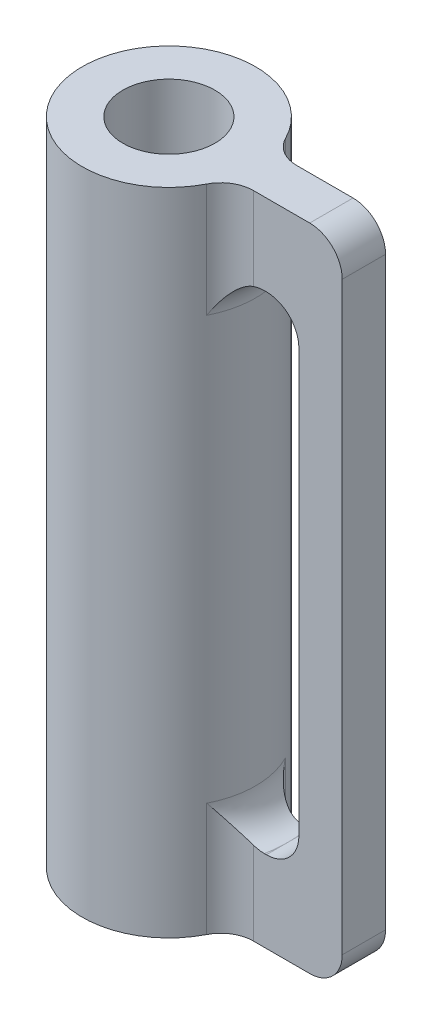
ISO-10303-21;
HEADER;
FILE_DESCRIPTION(('STEP AP214'),'2;1');
FILE_NAME('part.step','',(''),(''),'','','');
FILE_SCHEMA(('AUTOMOTIVE_DESIGN { 1 0 10303 214 1 1 1 1 }'));
ENDSEC;
DATA;
#1=APPLICATION_CONTEXT('core data for automotive mechanical design processes');
#2=APPLICATION_PROTOCOL_DEFINITION('international standard','automotive_design',2000,#1);
#3=PRODUCT_CONTEXT('',#1,'mechanical');
#4=PRODUCT('Part','Part','',(#3));
#5=PRODUCT_RELATED_PRODUCT_CATEGORY('part','',(#4));
#6=PRODUCT_DEFINITION_FORMATION('','',#4);
#7=PRODUCT_DEFINITION_CONTEXT('part definition',#1,'design');
#8=PRODUCT_DEFINITION('design','',#6,#7);
#9=PRODUCT_DEFINITION_SHAPE('','',#8);
#10=(LENGTH_UNIT() NAMED_UNIT(*) SI_UNIT(.MILLI.,.METRE.));
#11=(NAMED_UNIT(*) PLANE_ANGLE_UNIT() SI_UNIT($,.RADIAN.));
#12=(NAMED_UNIT(*) SI_UNIT($,.STERADIAN.) SOLID_ANGLE_UNIT());
#13=UNCERTAINTY_MEASURE_WITH_UNIT(LENGTH_MEASURE(1.E-05),#10,'distance_accuracy_value','');
#14=(GEOMETRIC_REPRESENTATION_CONTEXT(3) GLOBAL_UNCERTAINTY_ASSIGNED_CONTEXT((#13)) GLOBAL_UNIT_ASSIGNED_CONTEXT((#10,
#11,#12)) REPRESENTATION_CONTEXT('',''));
#15=CARTESIAN_POINT('',(0.,0.,0.));
#16=DIRECTION('',(0.,0.,1.));
#17=DIRECTION('',(1.,0.,0.));
#18=AXIS2_PLACEMENT_3D('',#15,#16,#17);
#19=CARTESIAN_POINT('',(0.,60.,0.));
#20=DIRECTION('',(0.,-1.,0.));
#21=DIRECTION('',(0.,0.,-1.));
#22=AXIS2_PLACEMENT_3D('',#19,#20,#21);
#23=CYLINDRICAL_SURFACE('',#22,4.25);
#24=CARTESIAN_POINT('',(0.,60.,0.));
#25=DIRECTION('',(0.,1.,0.));
#26=DIRECTION('',(0.,0.,1.));
#27=AXIS2_PLACEMENT_3D('',#24,#25,#26);
#28=CIRCLE('',#27,4.25);
#29=CARTESIAN_POINT('',(0.,60.,4.25));
#30=VERTEX_POINT('',#29);
#31=EDGE_CURVE('E215',#30,#30,#28,.T.);
#32=ORIENTED_EDGE('',*,*,#31,.T.);
#33=EDGE_LOOP('',(#32));
#34=FACE_BOUND('',#33,.T.);
#35=CARTESIAN_POINT('',(0.,30.,0.));
#36=DIRECTION('',(0.,-1.,0.));
#37=DIRECTION('',(0.,0.,-1.));
#38=AXIS2_PLACEMENT_3D('',#35,#36,#37);
#39=CIRCLE('',#38,4.25);
#40=CARTESIAN_POINT('',(0.,30.,-4.25));
#41=VERTEX_POINT('',#40);
#42=EDGE_CURVE('E44',#41,#41,#39,.T.);
#43=ORIENTED_EDGE('',*,*,#42,.T.);
#44=EDGE_LOOP('',(#43));
#45=FACE_BOUND('',#44,.T.);
#46=ADVANCED_FACE('F39',(#34,#45),#23,.F.);
#47=CARTESIAN_POINT('',(4.25,52.5,2.));
#48=DIRECTION('',(0.,1.,0.));
#49=DIRECTION('',(0.,0.,1.));
#50=AXIS2_PLACEMENT_3D('',#47,#48,#49);
#51=PLANE('',#50);
#52=DIRECTION('',(1.,0.,0.));
#53=VECTOR('',#52,1.);
#54=CARTESIAN_POINT('',(4.25,52.5,-2.));
#55=LINE('',#54,#53);
#56=CARTESIAN_POINT('',(10.816653826392,52.5,-2.));
#57=VERTEX_POINT('',#56);
#58=CARTESIAN_POINT('',(11.,52.5,-2.));
#59=VERTEX_POINT('',#58);
#60=EDGE_CURVE('E200',#57,#59,#55,.T.);
#61=ORIENTED_EDGE('',*,*,#60,.T.);
#62=DIRECTION('',(0.,0.,-1.));
#63=VECTOR('',#62,1.);
#64=CARTESIAN_POINT('',(11.,52.5,2.));
#65=LINE('',#64,#63);
#66=CARTESIAN_POINT('',(11.,52.5,0.));
#67=VERTEX_POINT('',#66);
#68=EDGE_CURVE('E263',#59,#67,#65,.F.);
#69=ORIENTED_EDGE('',*,*,#68,.T.);
#70=CARTESIAN_POINT('',(0.,52.5,0.));
#71=DIRECTION('',(0.,1.,0.));
#72=DIRECTION('',(0.,0.,1.));
#73=AXIS2_PLACEMENT_3D('',#70,#71,#72);
#74=CIRCLE('',#73,11.);
#75=EDGE_CURVE('E256',#67,#57,#74,.T.);
#76=ORIENTED_EDGE('',*,*,#75,.T.);
#77=EDGE_LOOP('',(#61,#69,#76));
#78=FACE_BOUND('',#77,.T.);
#79=ADVANCED_FACE('F411',(#78),#51,.F.);
#80=CARTESIAN_POINT('',(4.25,7.5,2.));
#81=DIRECTION('',(0.,-1.,0.));
#82=DIRECTION('',(0.,0.,-1.));
#83=AXIS2_PLACEMENT_3D('',#80,#81,#82);
#84=PLANE('',#83);
#85=DIRECTION('',(-1.,0.,0.));
#86=VECTOR('',#85,1.);
#87=CARTESIAN_POINT('',(4.25,7.5,2.));
#88=LINE('',#87,#86);
#89=CARTESIAN_POINT('',(11.,7.5,2.));
#90=VERTEX_POINT('',#89);
#91=CARTESIAN_POINT('',(10.816653826392,7.5,2.));
#92=VERTEX_POINT('',#91);
#93=EDGE_CURVE('E219',#90,#92,#88,.T.);
#94=ORIENTED_EDGE('',*,*,#93,.F.);
#95=DIRECTION('',(0.,0.,-1.));
#96=VECTOR('',#95,1.);
#97=CARTESIAN_POINT('',(11.,7.5,-2.));
#98=LINE('',#97,#96);
#99=CARTESIAN_POINT('',(11.,7.5,0.));
#100=VERTEX_POINT('',#99);
#101=EDGE_CURVE('E248',#90,#100,#98,.T.);
#102=ORIENTED_EDGE('',*,*,#101,.T.);
#103=CARTESIAN_POINT('',(0.,7.5,0.));
#104=DIRECTION('',(0.,-1.,0.));
#105=DIRECTION('',(0.,0.,-1.));
#106=AXIS2_PLACEMENT_3D('',#103,#104,#105);
#107=CIRCLE('',#106,11.);
#108=EDGE_CURVE('E241',#100,#92,#107,.T.);
#109=ORIENTED_EDGE('',*,*,#108,.T.);
#110=EDGE_LOOP('',(#94,#102,#109));
#111=FACE_BOUND('',#110,.T.);
#112=ADVANCED_FACE('F423',(#111),#84,.F.);
#113=CARTESIAN_POINT('',(0.,60.,0.));
#114=DIRECTION('',(0.,-1.,0.));
#115=DIRECTION('',(0.,0.,-1.));
#116=AXIS2_PLACEMENT_3D('',#113,#114,#115);
#117=CYLINDRICAL_SURFACE('',#116,8.);
#118=CARTESIAN_POINT('',(0.,10.5,0.));
#119=DIRECTION('',(0.,-1.,0.));
#120=DIRECTION('',(0.,0.,-1.));
#121=AXIS2_PLACEMENT_3D('',#118,#119,#120);
#122=CIRCLE('',#121,8.);
#123=CARTESIAN_POINT('',(7.12578834264197,10.5,3.63636363636364));
#124=VERTEX_POINT('',#123);
#125=CARTESIAN_POINT('',(7.12578834264197,10.5,-3.63636363636364));
#126=VERTEX_POINT('',#125);
#127=EDGE_CURVE('E274',#124,#126,#122,.F.);
#128=ORIENTED_EDGE('',*,*,#127,.T.);
#129=DIRECTION('',(0.,-1.,0.));
#130=VECTOR('',#129,1.);
#131=CARTESIAN_POINT('',(7.12578834264197,60.,-3.63636363636364));
#132=LINE('',#131,#130);
#133=CARTESIAN_POINT('',(7.12578834264197,0.,-3.63636363636364));
#134=VERTEX_POINT('',#133);
#135=EDGE_CURVE('E276',#126,#134,#132,.T.);
#136=ORIENTED_EDGE('',*,*,#135,.T.);
#137=CARTESIAN_POINT('',(0.,0.,0.));
#138=DIRECTION('',(0.,1.,0.));
#139=DIRECTION('',(0.,0.,1.));
#140=AXIS2_PLACEMENT_3D('',#137,#138,#139);
#141=CIRCLE('',#140,8.);
#142=CARTESIAN_POINT('',(7.12578834264197,0.,3.63636363636364));
#143=VERTEX_POINT('',#142);
#144=EDGE_CURVE('E218',#134,#143,#141,.T.);
#145=ORIENTED_EDGE('',*,*,#144,.T.);
#146=DIRECTION('',(0.,-1.,0.));
#147=VECTOR('',#146,1.);
#148=CARTESIAN_POINT('',(7.12578834264197,60.,3.63636363636364));
#149=LINE('',#148,#147);
#150=EDGE_CURVE('E272',#143,#124,#149,.F.);
#151=ORIENTED_EDGE('',*,*,#150,.T.);
#152=EDGE_LOOP('',(#128,#136,#145,#151));
#153=FACE_BOUND('',#152,.T.);
#154=CARTESIAN_POINT('',(0.,60.,0.));
#155=DIRECTION('',(0.,1.,0.));
#156=DIRECTION('',(0.,0.,1.));
#157=AXIS2_PLACEMENT_3D('',#154,#155,#156);
#158=CIRCLE('',#157,8.);
#159=CARTESIAN_POINT('',(7.12578834264197,60.,-3.63636363636364));
#160=VERTEX_POINT('',#159);
#161=CARTESIAN_POINT('',(7.12578834264197,60.,3.63636363636364));
#162=VERTEX_POINT('',#161);
#163=EDGE_CURVE('E220',#160,#162,#158,.T.);
#164=ORIENTED_EDGE('',*,*,#163,.F.);
#165=DIRECTION('',(0.,-1.,0.));
#166=VECTOR('',#165,1.);
#167=CARTESIAN_POINT('',(7.12578834264197,60.,-3.63636363636364));
#168=LINE('',#167,#166);
#169=CARTESIAN_POINT('',(7.12578834264197,49.5,-3.63636363636364));
#170=VERTEX_POINT('',#169);
#171=EDGE_CURVE('E270',#160,#170,#168,.T.);
#172=ORIENTED_EDGE('',*,*,#171,.T.);
#173=CARTESIAN_POINT('',(0.,49.5,0.));
#174=DIRECTION('',(0.,1.,0.));
#175=DIRECTION('',(0.,0.,1.));
#176=AXIS2_PLACEMENT_3D('',#173,#174,#175);
#177=CIRCLE('',#176,8.);
#178=CARTESIAN_POINT('',(7.12578834264197,49.5,3.63636363636364));
#179=VERTEX_POINT('',#178);
#180=EDGE_CURVE('E268',#170,#179,#177,.F.);
#181=ORIENTED_EDGE('',*,*,#180,.T.);
#182=DIRECTION('',(0.,-1.,0.));
#183=VECTOR('',#182,1.);
#184=CARTESIAN_POINT('',(7.12578834264197,60.,3.63636363636364));
#185=LINE('',#184,#183);
#186=EDGE_CURVE('E266',#179,#162,#185,.F.);
#187=ORIENTED_EDGE('',*,*,#186,.T.);
#188=EDGE_LOOP('',(#164,#172,#181,#187));
#189=FACE_BOUND('',#188,.T.);
#190=ADVANCED_FACE('F432',(#153,#189),#117,.T.);
#191=CARTESIAN_POINT('',(0.,60.,0.));
#192=DIRECTION('',(0.,1.,0.));
#193=DIRECTION('',(0.,0.,1.));
#194=AXIS2_PLACEMENT_3D('',#191,#192,#193);
#195=PLANE('',#194);
#196=ORIENTED_EDGE('',*,*,#31,.F.);
#197=EDGE_LOOP('',(#196));
#198=FACE_BOUND('',#197,.T.);
#199=DIRECTION('',(-1.,0.,0.));
#200=VECTOR('',#199,1.);
#201=CARTESIAN_POINT('',(18.,60.,2.));
#202=LINE('',#201,#200);
#203=CARTESIAN_POINT('',(15.,60.,2.));
#204=VERTEX_POINT('',#203);
#205=CARTESIAN_POINT('',(9.79795897113271,60.,2.));
#206=VERTEX_POINT('',#205);
#207=EDGE_CURVE('E376',#204,#206,#202,.T.);
#208=ORIENTED_EDGE('',*,*,#207,.F.);
#209=DIRECTION('',(0.,0.,-1.));
#210=VECTOR('',#209,1.);
#211=CARTESIAN_POINT('',(15.,60.,-2.));
#212=LINE('',#211,#210);
#213=CARTESIAN_POINT('',(15.,60.,-2.));
#214=VERTEX_POINT('',#213);
#215=EDGE_CURVE('E238',#204,#214,#212,.T.);
#216=ORIENTED_EDGE('',*,*,#215,.T.);
#217=DIRECTION('',(-1.,0.,0.));
#218=VECTOR('',#217,1.);
#219=CARTESIAN_POINT('',(18.,60.,-2.));
#220=LINE('',#219,#218);
#221=CARTESIAN_POINT('',(9.79795897113271,60.,-2.));
#222=VERTEX_POINT('',#221);
#223=EDGE_CURVE('E196',#214,#222,#220,.T.);
#224=ORIENTED_EDGE('',*,*,#223,.T.);
#225=CARTESIAN_POINT('',(9.79795897113271,60.,-5.));
#226=DIRECTION('',(0.,1.,0.));
#227=DIRECTION('',(0.,0.,1.));
#228=AXIS2_PLACEMENT_3D('',#225,#226,#227);
#229=CIRCLE('',#228,3.);
#230=EDGE_CURVE('E392',#222,#160,#229,.F.);
#231=ORIENTED_EDGE('',*,*,#230,.T.);
#232=ORIENTED_EDGE('',*,*,#163,.T.);
#233=CARTESIAN_POINT('',(9.79795897113271,60.,5.));
#234=DIRECTION('',(0.,1.,0.));
#235=DIRECTION('',(0.,0.,1.));
#236=AXIS2_PLACEMENT_3D('',#233,#234,#235);
#237=CIRCLE('',#236,3.);
#238=EDGE_CURVE('E12',#162,#206,#237,.F.);
#239=ORIENTED_EDGE('',*,*,#238,.T.);
#240=EDGE_LOOP('',(#208,#216,#224,#231,#232,#239));
#241=FACE_BOUND('',#240,.T.);
#242=ADVANCED_FACE('F436',(#198,#241),#195,.T.);
#243=CARTESIAN_POINT('',(0.,0.,0.));
#244=DIRECTION('',(0.,1.,0.));
#245=DIRECTION('',(0.,0.,1.));
#246=AXIS2_PLACEMENT_3D('',#243,#244,#245);
#247=PLANE('',#246);
#248=CARTESIAN_POINT('',(0.,0.,0.));
#249=DIRECTION('',(0.,-1.,0.));
#250=DIRECTION('',(0.,0.,-1.));
#251=AXIS2_PLACEMENT_3D('',#248,#249,#250);
#252=CIRCLE('',#251,6.25);
#253=CARTESIAN_POINT('',(0.,0.,-6.25));
#254=VERTEX_POINT('',#253);
#255=EDGE_CURVE('E366',#254,#254,#252,.T.);
#256=ORIENTED_EDGE('',*,*,#255,.F.);
#257=EDGE_LOOP('',(#256));
#258=FACE_BOUND('',#257,.T.);
#259=DIRECTION('',(1.,0.,0.));
#260=VECTOR('',#259,1.);
#261=CARTESIAN_POINT('',(18.,0.,-2.));
#262=LINE('',#261,#260);
#263=CARTESIAN_POINT('',(9.79795897113271,0.,-2.));
#264=VERTEX_POINT('',#263);
#265=CARTESIAN_POINT('',(15.,0.,-2.));
#266=VERTEX_POINT('',#265);
#267=EDGE_CURVE('E197',#264,#266,#262,.T.);
#268=ORIENTED_EDGE('',*,*,#267,.T.);
#269=DIRECTION('',(0.,0.,-1.));
#270=VECTOR('',#269,1.);
#271=CARTESIAN_POINT('',(15.,0.,0.));
#272=LINE('',#271,#270);
#273=CARTESIAN_POINT('',(15.,0.,2.));
#274=VERTEX_POINT('',#273);
#275=EDGE_CURVE('E179',#266,#274,#272,.F.);
#276=ORIENTED_EDGE('',*,*,#275,.T.);
#277=DIRECTION('',(1.,0.,0.));
#278=VECTOR('',#277,1.);
#279=CARTESIAN_POINT('',(18.,0.,2.));
#280=LINE('',#279,#278);
#281=CARTESIAN_POINT('',(9.79795897113271,0.,2.));
#282=VERTEX_POINT('',#281);
#283=EDGE_CURVE('E214',#282,#274,#280,.T.);
#284=ORIENTED_EDGE('',*,*,#283,.F.);
#285=CARTESIAN_POINT('',(9.79795897113271,0.,5.));
#286=DIRECTION('',(0.,1.,0.));
#287=DIRECTION('',(0.,0.,1.));
#288=AXIS2_PLACEMENT_3D('',#285,#286,#287);
#289=CIRCLE('',#288,3.);
#290=EDGE_CURVE('E49',#282,#143,#289,.T.);
#291=ORIENTED_EDGE('',*,*,#290,.T.);
#292=ORIENTED_EDGE('',*,*,#144,.F.);
#293=CARTESIAN_POINT('',(9.79795897113271,0.,-5.));
#294=DIRECTION('',(0.,1.,0.));
#295=DIRECTION('',(0.,0.,1.));
#296=AXIS2_PLACEMENT_3D('',#293,#294,#295);
#297=CIRCLE('',#296,3.);
#298=EDGE_CURVE('E323',#134,#264,#297,.T.);
#299=ORIENTED_EDGE('',*,*,#298,.T.);
#300=EDGE_LOOP('',(#268,#276,#284,#291,#292,#299));
#301=FACE_BOUND('',#300,.T.);
#302=ADVANCED_FACE('F465',(#258,#301),#247,.F.);
#303=CARTESIAN_POINT('',(0.,0.,2.));
#304=DIRECTION('',(0.,0.,-1.));
#305=DIRECTION('',(-1.,0.,0.));
#306=AXIS2_PLACEMENT_3D('',#303,#304,#305);
#307=PLANE('',#306);
#308=ORIENTED_EDGE('',*,*,#283,.T.);
#309=CARTESIAN_POINT('',(15.,3.,2.));
#310=DIRECTION('',(0.,0.,-1.));
#311=DIRECTION('',(-1.,0.,0.));
#312=AXIS2_PLACEMENT_3D('',#309,#310,#311);
#313=CIRCLE('',#312,3.);
#314=CARTESIAN_POINT('',(18.,3.,2.));
#315=VERTEX_POINT('',#314);
#316=EDGE_CURVE('E236',#274,#315,#313,.F.);
#317=ORIENTED_EDGE('',*,*,#316,.T.);
#318=DIRECTION('',(0.,1.,0.));
#319=VECTOR('',#318,1.);
#320=CARTESIAN_POINT('',(18.,0.,2.));
#321=LINE('',#320,#319);
#322=CARTESIAN_POINT('',(18.,57.,2.));
#323=VERTEX_POINT('',#322);
#324=EDGE_CURVE('E191',#315,#323,#321,.T.);
#325=ORIENTED_EDGE('',*,*,#324,.T.);
#326=CARTESIAN_POINT('',(15.,57.,2.));
#327=DIRECTION('',(0.,0.,-1.));
#328=DIRECTION('',(-1.,0.,0.));
#329=AXIS2_PLACEMENT_3D('',#326,#327,#328);
#330=CIRCLE('',#329,3.);
#331=EDGE_CURVE('E234',#323,#204,#330,.F.);
#332=ORIENTED_EDGE('',*,*,#331,.T.);
#333=ORIENTED_EDGE('',*,*,#207,.T.);
#334=DIRECTION('',(0.,1.,0.));
#335=VECTOR('',#334,1.);
#336=CARTESIAN_POINT('',(9.79795897113271,52.5,2.));
#337=LINE('',#336,#335);
#338=CARTESIAN_POINT('',(9.79795897113271,52.3284271247462,2.));
#339=VERTEX_POINT('',#338);
#340=EDGE_CURVE('E231',#206,#339,#337,.F.);
#341=ORIENTED_EDGE('',*,*,#340,.T.);
#342=CARTESIAN_POINT('',(9.79795897113271,52.3284271247462,2.));
#343=CARTESIAN_POINT('',(9.87996130512936,52.3568412531354,2.));
#344=CARTESIAN_POINT('',(9.96315414218799,52.3818150422225,2.));
#345=CARTESIAN_POINT('',(10.1307521327322,52.4245924143173,2.));
#346=CARTESIAN_POINT('',(10.2151449724638,52.4424442479209,2.));
#347=CARTESIAN_POINT('',(10.385123815675,52.4710839773299,2.));
#348=CARTESIAN_POINT('',(10.4707098541569,52.4818716654632,2.));
#349=CARTESIAN_POINT('',(10.6430782171678,52.4963583659184,2.));
#350=CARTESIAN_POINT('',(10.7298647218142,52.500007641822,2.));
#351=CARTESIAN_POINT('',(10.816653826392,52.5,2.));
#352=B_SPLINE_CURVE_WITH_KNOTS('',3,(#342,#343,#344,#345,#346,#347,#348,#349,#350,#351),
.UNSPECIFIED.,.F.,.F.,(4,2,2,2,4),(0.,0.260278991443893,0.518763385763604,0.777255378677352,
1.03754207145967),.UNSPECIFIED.);
#353=CARTESIAN_POINT('',(10.816653826392,52.5,2.));
#354=VERTEX_POINT('',#353);
#355=EDGE_CURVE('E295',#339,#354,#352,.T.);
#356=ORIENTED_EDGE('',*,*,#355,.T.);
#357=DIRECTION('',(1.,0.,0.));
#358=VECTOR('',#357,1.);
#359=CARTESIAN_POINT('',(4.25,52.5,2.));
#360=LINE('',#359,#358);
#361=CARTESIAN_POINT('',(11.,52.5,2.));
#362=VERTEX_POINT('',#361);
#363=EDGE_CURVE('E379',#354,#362,#360,.T.);
#364=ORIENTED_EDGE('',*,*,#363,.T.);
#365=CARTESIAN_POINT('',(11.,49.5,2.));
#366=DIRECTION('',(0.,0.,-1.));
#367=DIRECTION('',(-1.,0.,0.));
#368=AXIS2_PLACEMENT_3D('',#365,#366,#367);
#369=CIRCLE('',#368,3.);
#370=CARTESIAN_POINT('',(14.,49.5,2.));
#371=VERTEX_POINT('',#370);
#372=EDGE_CURVE('E284',#362,#371,#369,.T.);
#373=ORIENTED_EDGE('',*,*,#372,.T.);
#374=DIRECTION('',(0.,-1.,0.));
#375=VECTOR('',#374,1.);
#376=CARTESIAN_POINT('',(14.,7.5,2.));
#377=LINE('',#376,#375);
#378=CARTESIAN_POINT('',(14.,10.5,2.));
#379=VERTEX_POINT('',#378);
#380=EDGE_CURVE('E382',#371,#379,#377,.T.);
#381=ORIENTED_EDGE('',*,*,#380,.T.);
#382=CARTESIAN_POINT('',(11.,10.5,2.));
#383=DIRECTION('',(0.,0.,-1.));
#384=DIRECTION('',(-1.,0.,0.));
#385=AXIS2_PLACEMENT_3D('',#382,#383,#384);
#386=CIRCLE('',#385,3.);
#387=EDGE_CURVE('E280',#379,#90,#386,.T.);
#388=ORIENTED_EDGE('',*,*,#387,.T.);
#389=ORIENTED_EDGE('',*,*,#93,.T.);
#390=CARTESIAN_POINT('',(10.816653826392,7.5,2.));
#391=CARTESIAN_POINT('',(10.7298647218142,7.49999235817803,2.));
#392=CARTESIAN_POINT('',(10.6430782171678,7.50364163408163,2.));
#393=CARTESIAN_POINT('',(10.4707098541569,7.51812833453679,2.));
#394=CARTESIAN_POINT('',(10.385123815675,7.5289160226701,2.));
#395=CARTESIAN_POINT('',(10.2151449724638,7.55755575207905,2.));
#396=CARTESIAN_POINT('',(10.1307521327322,7.57540758568265,2.));
#397=CARTESIAN_POINT('',(9.96315414218798,7.61818495777747,2.));
#398=CARTESIAN_POINT('',(9.87996130512936,7.64315874686454,2.));
#399=CARTESIAN_POINT('',(9.79795897113271,7.67157287525381,2.));
#400=B_SPLINE_CURVE_WITH_KNOTS('',3,(#390,#391,#392,#393,#394,#395,#396,#397,#398,#399),
.UNSPECIFIED.,.F.,.F.,(4,2,2,2,4),(0.,0.260286692782313,0.518778685696062,0.777263080015777,
1.03754207145966),.UNSPECIFIED.);
#401=CARTESIAN_POINT('',(9.79795897113271,7.67157287525381,2.));
#402=VERTEX_POINT('',#401);
#403=EDGE_CURVE('E324',#92,#402,#400,.T.);
#404=ORIENTED_EDGE('',*,*,#403,.T.);
#405=DIRECTION('',(0.,1.,0.));
#406=VECTOR('',#405,1.);
#407=CARTESIAN_POINT('',(9.79795897113271,0.,2.));
#408=LINE('',#407,#406);
#409=EDGE_CURVE('E65',#402,#282,#408,.F.);
#410=ORIENTED_EDGE('',*,*,#409,.T.);
#411=EDGE_LOOP('',(#308,#317,#325,#332,#333,#341,#356,#364,#373,#381,#388,#389,#404,#410));
#412=FACE_BOUND('',#411,.T.);
#413=ADVANCED_FACE('F309',(#412),#307,.F.);
#414=CARTESIAN_POINT('',(0.,0.,-2.));
#415=DIRECTION('',(0.,0.,-1.));
#416=DIRECTION('',(-1.,0.,0.));
#417=AXIS2_PLACEMENT_3D('',#414,#415,#416);
#418=PLANE('',#417);
#419=DIRECTION('',(0.,1.,0.));
#420=VECTOR('',#419,1.);
#421=CARTESIAN_POINT('',(18.,0.,-2.));
#422=LINE('',#421,#420);
#423=CARTESIAN_POINT('',(18.,3.,-2.));
#424=VERTEX_POINT('',#423);
#425=CARTESIAN_POINT('',(18.,57.,-2.));
#426=VERTEX_POINT('',#425);
#427=EDGE_CURVE('E188',#424,#426,#422,.T.);
#428=ORIENTED_EDGE('',*,*,#427,.F.);
#429=CARTESIAN_POINT('',(15.,3.,-2.));
#430=DIRECTION('',(0.,0.,-1.));
#431=DIRECTION('',(-1.,0.,0.));
#432=AXIS2_PLACEMENT_3D('',#429,#430,#431);
#433=CIRCLE('',#432,3.);
#434=EDGE_CURVE('E174',#424,#266,#433,.T.);
#435=ORIENTED_EDGE('',*,*,#434,.T.);
#436=ORIENTED_EDGE('',*,*,#267,.F.);
#437=DIRECTION('',(0.,-1.,0.));
#438=VECTOR('',#437,1.);
#439=CARTESIAN_POINT('',(9.79795897113271,0.,-2.));
#440=LINE('',#439,#438);
#441=CARTESIAN_POINT('',(9.79795897113271,7.67157287525381,-2.));
#442=VERTEX_POINT('',#441);
#443=EDGE_CURVE('E57',#264,#442,#440,.F.);
#444=ORIENTED_EDGE('',*,*,#443,.T.);
#445=CARTESIAN_POINT('',(9.79795897113271,7.67157287525381,-2.));
#446=CARTESIAN_POINT('',(9.87996130512936,7.64315874686455,-2.));
#447=CARTESIAN_POINT('',(9.96315414218799,7.61818495777747,-2.));
#448=CARTESIAN_POINT('',(10.1307521327322,7.57540758568265,-2.));
#449=CARTESIAN_POINT('',(10.2151449724638,7.55755575207905,-2.));
#450=CARTESIAN_POINT('',(10.385123815675,7.5289160226701,-2.));
#451=CARTESIAN_POINT('',(10.4707098541569,7.51812833453679,-2.));
#452=CARTESIAN_POINT('',(10.6430782171678,7.50364163408163,-2.));
#453=CARTESIAN_POINT('',(10.7298647218142,7.49999235817803,-2.));
#454=CARTESIAN_POINT('',(10.816653826392,7.5,-2.));
#455=B_SPLINE_CURVE_WITH_KNOTS('',3,(#445,#446,#447,#448,#449,#450,#451,#452,#453,#454),
.UNSPECIFIED.,.F.,.F.,(4,2,2,2,4),(0.,0.260278991443891,0.518763385763604,0.777255378677351,
1.03754207145966),.UNSPECIFIED.);
#456=CARTESIAN_POINT('',(10.816653826392,7.5,-2.));
#457=VERTEX_POINT('',#456);
#458=EDGE_CURVE('E316',#442,#457,#455,.T.);
#459=ORIENTED_EDGE('',*,*,#458,.T.);
#460=DIRECTION('',(-1.,0.,0.));
#461=VECTOR('',#460,1.);
#462=CARTESIAN_POINT('',(4.25,7.5,-2.));
#463=LINE('',#462,#461);
#464=CARTESIAN_POINT('',(11.,7.5,-2.));
#465=VERTEX_POINT('',#464);
#466=EDGE_CURVE('E211',#465,#457,#463,.T.);
#467=ORIENTED_EDGE('',*,*,#466,.F.);
#468=CARTESIAN_POINT('',(11.,10.5,-2.));
#469=DIRECTION('',(0.,0.,-1.));
#470=DIRECTION('',(-1.,0.,0.));
#471=AXIS2_PLACEMENT_3D('',#468,#469,#470);
#472=CIRCLE('',#471,3.);
#473=CARTESIAN_POINT('',(14.,10.5,-2.));
#474=VERTEX_POINT('',#473);
#475=EDGE_CURVE('E278',#465,#474,#472,.F.);
#476=ORIENTED_EDGE('',*,*,#475,.T.);
#477=DIRECTION('',(0.,-1.,0.));
#478=VECTOR('',#477,1.);
#479=CARTESIAN_POINT('',(14.,7.5,-2.));
#480=LINE('',#479,#478);
#481=CARTESIAN_POINT('',(14.,49.5,-2.));
#482=VERTEX_POINT('',#481);
#483=EDGE_CURVE('E208',#482,#474,#480,.T.);
#484=ORIENTED_EDGE('',*,*,#483,.F.);
#485=CARTESIAN_POINT('',(11.,49.5,-2.));
#486=DIRECTION('',(0.,0.,-1.));
#487=DIRECTION('',(-1.,0.,0.));
#488=AXIS2_PLACEMENT_3D('',#485,#486,#487);
#489=CIRCLE('',#488,3.);
#490=EDGE_CURVE('E282',#482,#59,#489,.F.);
#491=ORIENTED_EDGE('',*,*,#490,.T.);
#492=ORIENTED_EDGE('',*,*,#60,.F.);
#493=CARTESIAN_POINT('',(10.816653826392,52.5,-2.));
#494=CARTESIAN_POINT('',(10.7298647218142,52.500007641822,-2.));
#495=CARTESIAN_POINT('',(10.6430782171678,52.4963583659184,-2.));
#496=CARTESIAN_POINT('',(10.4707098541569,52.4818716654632,-2.));
#497=CARTESIAN_POINT('',(10.385123815675,52.4710839773299,-2.));
#498=CARTESIAN_POINT('',(10.2151449724638,52.4424442479209,-2.));
#499=CARTESIAN_POINT('',(10.1307521327322,52.4245924143173,-2.));
#500=CARTESIAN_POINT('',(9.96315414218799,52.3818150422225,-2.));
#501=CARTESIAN_POINT('',(9.87996130512936,52.3568412531354,-2.));
#502=CARTESIAN_POINT('',(9.79795897113271,52.3284271247462,-2.));
#503=B_SPLINE_CURVE_WITH_KNOTS('',3,(#493,#494,#495,#496,#497,#498,#499,#500,#501,#502),
.UNSPECIFIED.,.F.,.F.,(4,2,2,2,4),(0.,0.260286692782313,0.518778685696061,0.777263080015772,
1.03754207145967),.UNSPECIFIED.);
#504=CARTESIAN_POINT('',(9.79795897113271,52.3284271247462,-2.));
#505=VERTEX_POINT('',#504);
#506=EDGE_CURVE('E286',#57,#505,#503,.T.);
#507=ORIENTED_EDGE('',*,*,#506,.T.);
#508=DIRECTION('',(0.,-1.,0.));
#509=VECTOR('',#508,1.);
#510=CARTESIAN_POINT('',(9.79795897113271,0.,-2.));
#511=LINE('',#510,#509);
#512=EDGE_CURVE('E227',#505,#222,#511,.F.);
#513=ORIENTED_EDGE('',*,*,#512,.T.);
#514=ORIENTED_EDGE('',*,*,#223,.F.);
#515=CARTESIAN_POINT('',(15.,57.,-2.));
#516=DIRECTION('',(0.,0.,-1.));
#517=DIRECTION('',(-1.,0.,0.));
#518=AXIS2_PLACEMENT_3D('',#515,#516,#517);
#519=CIRCLE('',#518,3.);
#520=EDGE_CURVE('E182',#214,#426,#519,.T.);
#521=ORIENTED_EDGE('',*,*,#520,.T.);
#522=EDGE_LOOP('',(#428,#435,#436,#444,#459,#467,#476,#484,#491,#492,#507,#513,#514,#521));
#523=FACE_BOUND('',#522,.T.);
#524=ADVANCED_FACE('F194',(#523),#418,.T.);
#525=CARTESIAN_POINT('',(18.,0.,2.));
#526=DIRECTION('',(-1.,0.,0.));
#527=DIRECTION('',(0.,0.,1.));
#528=AXIS2_PLACEMENT_3D('',#525,#526,#527);
#529=PLANE('',#528);
#530=ORIENTED_EDGE('',*,*,#324,.F.);
#531=DIRECTION('',(0.,0.,-1.));
#532=VECTOR('',#531,1.);
#533=CARTESIAN_POINT('',(18.,3.,2.));
#534=LINE('',#533,#532);
#535=EDGE_CURVE('E178',#315,#424,#534,.T.);
#536=ORIENTED_EDGE('',*,*,#535,.T.);
#537=ORIENTED_EDGE('',*,*,#427,.T.);
#538=DIRECTION('',(0.,0.,-1.));
#539=VECTOR('',#538,1.);
#540=CARTESIAN_POINT('',(18.,57.,2.));
#541=LINE('',#540,#539);
#542=EDGE_CURVE('E192',#426,#323,#541,.F.);
#543=ORIENTED_EDGE('',*,*,#542,.T.);
#544=EDGE_LOOP('',(#530,#536,#537,#543));
#545=FACE_BOUND('',#544,.T.);
#546=ADVANCED_FACE('F187',(#545),#529,.F.);
#547=CARTESIAN_POINT('',(0.,52.5,0.));
#548=DIRECTION('',(0.,1.,0.));
#549=DIRECTION('',(0.,0.,1.));
#550=AXIS2_PLACEMENT_3D('',#547,#548,#549);
#551=CIRCLE('',#550,11.);
#552=EDGE_CURVE('E258',#354,#67,#551,.T.);
#553=ORIENTED_EDGE('',*,*,#552,.T.);
#554=DIRECTION('',(0.,0.,-1.));
#555=VECTOR('',#554,1.);
#556=CARTESIAN_POINT('',(11.,52.5,2.));
#557=LINE('',#556,#555);
#558=EDGE_CURVE('E261',#67,#362,#557,.F.);
#559=ORIENTED_EDGE('',*,*,#558,.T.);
#560=ORIENTED_EDGE('',*,*,#363,.F.);
#561=EDGE_LOOP('',(#553,#559,#560));
#562=FACE_BOUND('',#561,.T.);
#563=ADVANCED_FACE('F405',(#562),#51,.F.);
#564=CARTESIAN_POINT('',(14.,7.5,2.));
#565=DIRECTION('',(1.,0.,0.));
#566=DIRECTION('',(0.,0.,-1.));
#567=AXIS2_PLACEMENT_3D('',#564,#565,#566);
#568=PLANE('',#567);
#569=ORIENTED_EDGE('',*,*,#483,.T.);
#570=DIRECTION('',(0.,0.,-1.));
#571=VECTOR('',#570,1.);
#572=CARTESIAN_POINT('',(14.,10.5,2.));
#573=LINE('',#572,#571);
#574=EDGE_CURVE('E254',#474,#379,#573,.F.);
#575=ORIENTED_EDGE('',*,*,#574,.T.);
#576=ORIENTED_EDGE('',*,*,#380,.F.);
#577=DIRECTION('',(0.,0.,-1.));
#578=VECTOR('',#577,1.);
#579=CARTESIAN_POINT('',(14.,49.5,-2.));
#580=LINE('',#579,#578);
#581=EDGE_CURVE('E251',#371,#482,#580,.T.);
#582=ORIENTED_EDGE('',*,*,#581,.T.);
#583=EDGE_LOOP('',(#569,#575,#576,#582));
#584=FACE_BOUND('',#583,.T.);
#585=ADVANCED_FACE('F417',(#584),#568,.F.);
#586=CARTESIAN_POINT('',(0.,7.5,0.));
#587=DIRECTION('',(0.,-1.,0.));
#588=DIRECTION('',(0.,0.,-1.));
#589=AXIS2_PLACEMENT_3D('',#586,#587,#588);
#590=CIRCLE('',#589,11.);
#591=EDGE_CURVE('E243',#457,#100,#590,.T.);
#592=ORIENTED_EDGE('',*,*,#591,.T.);
#593=DIRECTION('',(0.,0.,-1.));
#594=VECTOR('',#593,1.);
#595=CARTESIAN_POINT('',(11.,7.5,-2.));
#596=LINE('',#595,#594);
#597=EDGE_CURVE('E246',#100,#465,#596,.T.);
#598=ORIENTED_EDGE('',*,*,#597,.T.);
#599=ORIENTED_EDGE('',*,*,#466,.T.);
#600=EDGE_LOOP('',(#592,#598,#599));
#601=FACE_BOUND('',#600,.T.);
#602=ADVANCED_FACE('F312',(#601),#84,.F.);
#603=CARTESIAN_POINT('',(15.,3.,2.));
#604=DIRECTION('',(0.,0.,-1.));
#605=DIRECTION('',(-1.,0.,0.));
#606=AXIS2_PLACEMENT_3D('',#603,#604,#605);
#607=CYLINDRICAL_SURFACE('',#606,3.);
#608=ORIENTED_EDGE('',*,*,#316,.F.);
#609=ORIENTED_EDGE('',*,*,#275,.F.);
#610=ORIENTED_EDGE('',*,*,#434,.F.);
#611=ORIENTED_EDGE('',*,*,#535,.F.);
#612=EDGE_LOOP('',(#608,#609,#610,#611));
#613=FACE_BOUND('',#612,.T.);
#614=ADVANCED_FACE('F177',(#613),#607,.T.);
#615=CARTESIAN_POINT('',(15.,57.,0.));
#616=DIRECTION('',(0.,0.,1.));
#617=DIRECTION('',(1.,0.,0.));
#618=AXIS2_PLACEMENT_3D('',#615,#616,#617);
#619=CYLINDRICAL_SURFACE('',#618,3.);
#620=ORIENTED_EDGE('',*,*,#331,.F.);
#621=ORIENTED_EDGE('',*,*,#542,.F.);
#622=ORIENTED_EDGE('',*,*,#520,.F.);
#623=ORIENTED_EDGE('',*,*,#215,.F.);
#624=EDGE_LOOP('',(#620,#621,#622,#623));
#625=FACE_BOUND('',#624,.T.);
#626=ADVANCED_FACE('F475',(#625),#619,.T.);
#627=CARTESIAN_POINT('',(11.,10.5,2.));
#628=DIRECTION('',(0.,0.,1.));
#629=DIRECTION('',(1.,0.,0.));
#630=AXIS2_PLACEMENT_3D('',#627,#628,#629);
#631=CYLINDRICAL_SURFACE('',#630,3.);
#632=ORIENTED_EDGE('',*,*,#387,.F.);
#633=ORIENTED_EDGE('',*,*,#574,.F.);
#634=ORIENTED_EDGE('',*,*,#475,.F.);
#635=ORIENTED_EDGE('',*,*,#597,.F.);
#636=ORIENTED_EDGE('',*,*,#101,.F.);
#637=EDGE_LOOP('',(#632,#633,#634,#635,#636));
#638=FACE_BOUND('',#637,.T.);
#639=ADVANCED_FACE('F422',(#638),#631,.F.);
#640=CARTESIAN_POINT('',(11.,49.5,2.));
#641=DIRECTION('',(0.,0.,1.));
#642=DIRECTION('',(1.,0.,0.));
#643=AXIS2_PLACEMENT_3D('',#640,#641,#642);
#644=CYLINDRICAL_SURFACE('',#643,3.);
#645=ORIENTED_EDGE('',*,*,#558,.F.);
#646=ORIENTED_EDGE('',*,*,#68,.F.);
#647=ORIENTED_EDGE('',*,*,#490,.F.);
#648=ORIENTED_EDGE('',*,*,#581,.F.);
#649=ORIENTED_EDGE('',*,*,#372,.F.);
#650=EDGE_LOOP('',(#645,#646,#647,#648,#649));
#651=FACE_BOUND('',#650,.T.);
#652=ADVANCED_FACE('F413',(#651),#644,.F.);
#653=CARTESIAN_POINT('',(9.79795897113271,60.,5.));
#654=DIRECTION('',(0.,-1.,0.));
#655=DIRECTION('',(0.,0.,-1.));
#656=AXIS2_PLACEMENT_3D('',#653,#654,#655);
#657=CYLINDRICAL_SURFACE('',#656,3.);
#658=ORIENTED_EDGE('',*,*,#238,.F.);
#659=ORIENTED_EDGE('',*,*,#186,.F.);
#660=CARTESIAN_POINT('',(9.79795897113271,52.3284271247462,2.));
#661=CARTESIAN_POINT('',(9.7173734492159,52.3005320852669,1.99998953639349));
#662=CARTESIAN_POINT('',(9.63794776062869,52.2695236133374,2.00324553893388));
#663=CARTESIAN_POINT('',(9.48212850227284,52.2020372925825,2.01565298953806));
#664=CARTESIAN_POINT('',(9.4057286029864,52.1655717169521,2.02479135647914));
#665=CARTESIAN_POINT('',(9.25733745733954,52.0883330213257,2.04816990531204));
#666=CARTESIAN_POINT('',(9.18530007412871,52.0476259374755,2.06233829709498));
#667=CARTESIAN_POINT('',(9.04473230182231,51.9621148580962,2.09520018211849));
#668=CARTESIAN_POINT('',(8.97620430688398,51.9173081222998,2.11389671598842));
#669=CARTESIAN_POINT('',(8.82256696009966,51.8100583474172,2.16153212280672));
#670=CARTESIAN_POINT('',(8.73874050494732,51.7463911135124,2.19185722980529));
#671=CARTESIAN_POINT('',(8.57737304498222,51.6142780116578,2.25814349703069));
#672=CARTESIAN_POINT('',(8.49983321881371,51.5458312520785,2.29410571043618));
#673=CARTESIAN_POINT('',(8.27533405730233,51.3337809822147,2.40961017147629));
#674=CARTESIAN_POINT('',(8.13759969929152,51.1842656706707,2.49640304006923));
#675=CARTESIAN_POINT('',(7.91293728836031,50.910161415457,2.66298603747953));
#676=CARTESIAN_POINT('',(7.82152646382456,50.7874398525896,2.74002870705435));
#677=CARTESIAN_POINT('',(7.65110667070149,50.5379599773742,2.90124184597951));
#678=CARTESIAN_POINT('',(7.57210628198723,50.4111989445578,2.9854171851018));
#679=CARTESIAN_POINT('',(7.42598279330116,50.1556203422448,3.15971968085874));
#680=CARTESIAN_POINT('',(7.35882899856423,50.0268090591676,3.24983059978638));
#681=CARTESIAN_POINT('',(7.23564161823099,49.7680975087744,3.43572756706677));
#682=CARTESIAN_POINT('',(7.17960016322309,49.6381980804842,3.5315095364863));
#683=CARTESIAN_POINT('',(7.12794483716138,49.5055567048406,3.6321439780848));
#684=CARTESIAN_POINT('',(7.12686533873331,49.5027783410164,3.63425317969078));
#685=CARTESIAN_POINT('',(7.12578834264197,49.5,3.63636363636364));
#686=B_SPLINE_CURVE_WITH_KNOTS('',3,(#660,#661,#662,#663,#664,#665,#666,#667,#668,#669,#670,
#671,#672,#673,#674,#675,#676,#677,#678,#679,#680,#681,#682,#683,#684,#685),.UNSPECIFIED.,.F.,
.F.,(4,2,2,2,2,2,2,2,2,2,2,2,4),(0.,0.25559190076055,0.510617374132474,0.762140419205112,
1.01383283157583,1.34194477702257,1.67011809673723,2.330648528254,2.84402768048109,
3.35776020670378,3.87014144007646,4.38215851490668,4.39311296929358),.UNSPECIFIED.);
#687=EDGE_CURVE('E202',#339,#179,#686,.T.);
#688=ORIENTED_EDGE('',*,*,#687,.F.);
#689=ORIENTED_EDGE('',*,*,#340,.F.);
#690=EDGE_LOOP('',(#658,#659,#688,#689));
#691=FACE_BOUND('',#690,.T.);
#692=ADVANCED_FACE('F438',(#691),#657,.F.);
#693=CARTESIAN_POINT('',(9.79795897113271,60.,-5.));
#694=DIRECTION('',(0.,-1.,0.));
#695=DIRECTION('',(0.,0.,-1.));
#696=AXIS2_PLACEMENT_3D('',#693,#694,#695);
#697=CYLINDRICAL_SURFACE('',#696,3.);
#698=ORIENTED_EDGE('',*,*,#512,.F.);
#699=CARTESIAN_POINT('',(9.79795897113271,52.3284271247462,-2.));
#700=CARTESIAN_POINT('',(9.7173734492159,52.3005320852669,-1.99998953639349));
#701=CARTESIAN_POINT('',(9.63794776062869,52.2695236133374,-2.00324553893388));
#702=CARTESIAN_POINT('',(9.48212850227284,52.2020372925825,-2.01565298953806));
#703=CARTESIAN_POINT('',(9.4057286029864,52.1655717169521,-2.02479135647914));
#704=CARTESIAN_POINT('',(9.25733745733954,52.0883330213257,-2.04816990531204));
#705=CARTESIAN_POINT('',(9.18530007412871,52.0476259374755,-2.06233829709498));
#706=CARTESIAN_POINT('',(9.04473230182231,51.9621148580962,-2.09520018211849));
#707=CARTESIAN_POINT('',(8.97620430688398,51.9173081222998,-2.11389671598842));
#708=CARTESIAN_POINT('',(8.82256696009966,51.8100583474172,-2.16153212280672));
#709=CARTESIAN_POINT('',(8.73874050494732,51.7463911135124,-2.19185722980529));
#710=CARTESIAN_POINT('',(8.57737304498222,51.6142780116578,-2.25814349703069));
#711=CARTESIAN_POINT('',(8.49983321881371,51.5458312520785,-2.29410571043618));
#712=CARTESIAN_POINT('',(8.27533405730233,51.3337809822147,-2.40961017147629));
#713=CARTESIAN_POINT('',(8.13759969929152,51.1842656706707,-2.49640304006923));
#714=CARTESIAN_POINT('',(7.91293728836031,50.910161415457,-2.66298603747953));
#715=CARTESIAN_POINT('',(7.82152646382456,50.7874398525896,-2.74002870705435));
#716=CARTESIAN_POINT('',(7.65110667070149,50.5379599773742,-2.90124184597951));
#717=CARTESIAN_POINT('',(7.57210628198723,50.4111989445578,-2.9854171851018));
#718=CARTESIAN_POINT('',(7.42598279330116,50.1556203422448,-3.15971968085874));
#719=CARTESIAN_POINT('',(7.35882899856423,50.0268090591676,-3.24983059978638));
#720=CARTESIAN_POINT('',(7.23564161823099,49.7680975087744,-3.43572756706677));
#721=CARTESIAN_POINT('',(7.17960016322309,49.6381980804842,-3.5315095364863));
#722=CARTESIAN_POINT('',(7.12794483716138,49.5055567048406,-3.6321439780848));
#723=CARTESIAN_POINT('',(7.12686533873331,49.5027783410164,-3.63425317969078));
#724=CARTESIAN_POINT('',(7.12578834264197,49.5,-3.63636363636364));
#725=B_SPLINE_CURVE_WITH_KNOTS('',3,(#699,#700,#701,#702,#703,#704,#705,#706,#707,#708,#709,
#710,#711,#712,#713,#714,#715,#716,#717,#718,#719,#720,#721,#722,#723,#724),.UNSPECIFIED.,.F.,
.F.,(4,2,2,2,2,2,2,2,2,2,2,2,4),(0.,0.25559190076055,0.510617374132474,0.762140419205112,
1.01383283157583,1.34194477702257,1.67011809673723,2.330648528254,2.84402768048109,
3.35776020670378,3.87014144007646,4.38215851490668,4.39311296929358),.UNSPECIFIED.);
#726=EDGE_CURVE('E354',#170,#505,#725,.F.);
#727=ORIENTED_EDGE('',*,*,#726,.F.);
#728=ORIENTED_EDGE('',*,*,#171,.F.);
#729=ORIENTED_EDGE('',*,*,#230,.F.);
#730=EDGE_LOOP('',(#698,#727,#728,#729));
#731=FACE_BOUND('',#730,.T.);
#732=ADVANCED_FACE('F430',(#731),#697,.F.);
#733=CARTESIAN_POINT('',(0.,49.5,0.));
#734=DIRECTION('',(0.,1.,0.));
#735=DIRECTION('',(0.,0.,1.));
#736=AXIS2_PLACEMENT_3D('',#733,#734,#735);
#737=TOROIDAL_SURFACE('',#736,11.,3.);
#738=ORIENTED_EDGE('',*,*,#687,.T.);
#739=ORIENTED_EDGE('',*,*,#180,.F.);
#740=ORIENTED_EDGE('',*,*,#726,.T.);
#741=ORIENTED_EDGE('',*,*,#506,.F.);
#742=ORIENTED_EDGE('',*,*,#75,.F.);
#743=ORIENTED_EDGE('',*,*,#552,.F.);
#744=ORIENTED_EDGE('',*,*,#355,.F.);
#745=EDGE_LOOP('',(#738,#739,#740,#741,#742,#743,#744));
#746=FACE_BOUND('',#745,.T.);
#747=ADVANCED_FACE('F302',(#746),#737,.F.);
#748=CARTESIAN_POINT('',(9.79795897113271,60.,-5.));
#749=DIRECTION('',(0.,-1.,0.));
#750=DIRECTION('',(0.,0.,-1.));
#751=AXIS2_PLACEMENT_3D('',#748,#749,#750);
#752=CYLINDRICAL_SURFACE('',#751,3.);
#753=ORIENTED_EDGE('',*,*,#298,.F.);
#754=ORIENTED_EDGE('',*,*,#135,.F.);
#755=CARTESIAN_POINT('',(9.79795897113271,7.67157287525381,-2.));
#756=CARTESIAN_POINT('',(9.71737344921591,7.6994679147331,-1.99998953639349));
#757=CARTESIAN_POINT('',(9.63794776062872,7.73047638666258,-2.00324553893388));
#758=CARTESIAN_POINT('',(9.48212850227291,7.79796270741751,-2.01565298953805));
#759=CARTESIAN_POINT('',(9.40572860298649,7.83442828304788,-2.02479135647913));
#760=CARTESIAN_POINT('',(9.25733745733962,7.91166697867421,-2.04816990531202));
#761=CARTESIAN_POINT('',(9.18530007412877,7.95237406252442,-2.06233829709497));
#762=CARTESIAN_POINT('',(9.04473230182235,8.03788514190377,-2.09520018211848));
#763=CARTESIAN_POINT('',(8.976204306884,8.08269187770016,-2.11389671598841));
#764=CARTESIAN_POINT('',(8.82256696009966,8.18994165258282,-2.16153212280672));
#765=CARTESIAN_POINT('',(8.73874050494731,8.25360888648756,-2.1918572298053));
#766=CARTESIAN_POINT('',(8.57737304498218,8.38572198834222,-2.25814349703071));
#767=CARTESIAN_POINT('',(8.49983321881365,8.45416874792153,-2.29410571043621));
#768=CARTESIAN_POINT('',(8.2753340573023,8.66621901778533,-2.40961017147631));
#769=CARTESIAN_POINT('',(8.13759969929152,8.81573432932932,-2.49640304006922));
#770=CARTESIAN_POINT('',(7.9129372883603,9.08983858454293,-2.66298603747954));
#771=CARTESIAN_POINT('',(7.82152646382452,9.21256014741028,-2.74002870705442));
#772=CARTESIAN_POINT('',(7.65110667070155,9.46204002262579,-2.90124184597942));
#773=CARTESIAN_POINT('',(7.57210628198739,9.58880105544237,-2.9854171851015));
#774=CARTESIAN_POINT('',(7.42598279330105,9.84437965775492,-3.15971968085897));
#775=CARTESIAN_POINT('',(7.35882899856375,9.97319094083142,-3.24983059978734));
#776=CARTESIAN_POINT('',(7.23564161823151,10.2319024912265,-3.43572756706576));
#777=CARTESIAN_POINT('',(7.17960016322499,10.3618019195194,-3.5315095364826));
#778=CARTESIAN_POINT('',(7.12794483716146,10.4944432951595,-3.63214397808464));
#779=CARTESIAN_POINT('',(7.12686533873335,10.4972216589837,-3.6342531796907));
#780=CARTESIAN_POINT('',(7.12578834264197,10.5,-3.63636363636364));
#781=B_SPLINE_CURVE_WITH_KNOTS('',3,(#755,#756,#757,#758,#759,#760,#761,#762,#763,#764,#765,
#766,#767,#768,#769,#770,#771,#772,#773,#774,#775,#776,#777,#778,#779,#780),.UNSPECIFIED.,.F.,
.F.,(4,2,2,2,2,2,2,2,2,2,2,2,4),(0.,0.255591900760496,0.510617374132364,0.762140419205053,
1.01383283157583,1.34194477702261,1.67011809673732,2.33064852825399,2.84402768048108,
3.3577602067037,3.87014144007641,4.38215851490668,4.39311296929358),.UNSPECIFIED.);
#782=EDGE_CURVE('E348',#442,#126,#781,.T.);
#783=ORIENTED_EDGE('',*,*,#782,.F.);
#784=ORIENTED_EDGE('',*,*,#443,.F.);
#785=EDGE_LOOP('',(#753,#754,#783,#784));
#786=FACE_BOUND('',#785,.T.);
#787=ADVANCED_FACE('F41',(#786),#752,.F.);
#788=CARTESIAN_POINT('',(9.79795897113271,60.,5.));
#789=DIRECTION('',(0.,-1.,0.));
#790=DIRECTION('',(0.,0.,-1.));
#791=AXIS2_PLACEMENT_3D('',#788,#789,#790);
#792=CYLINDRICAL_SURFACE('',#791,3.);
#793=ORIENTED_EDGE('',*,*,#409,.F.);
#794=CARTESIAN_POINT('',(9.79795897113271,7.67157287525381,2.));
#795=CARTESIAN_POINT('',(9.71737344921591,7.6994679147331,1.99998953639349));
#796=CARTESIAN_POINT('',(9.63794776062872,7.73047638666258,2.00324553893388));
#797=CARTESIAN_POINT('',(9.48212850227291,7.79796270741751,2.01565298953805));
#798=CARTESIAN_POINT('',(9.40572860298649,7.83442828304788,2.02479135647913));
#799=CARTESIAN_POINT('',(9.25733745733962,7.91166697867421,2.04816990531202));
#800=CARTESIAN_POINT('',(9.18530007412877,7.95237406252442,2.06233829709497));
#801=CARTESIAN_POINT('',(9.04473230182235,8.03788514190377,2.09520018211848));
#802=CARTESIAN_POINT('',(8.976204306884,8.08269187770016,2.11389671598841));
#803=CARTESIAN_POINT('',(8.82256696009966,8.18994165258282,2.16153212280672));
#804=CARTESIAN_POINT('',(8.73874050494731,8.25360888648756,2.1918572298053));
#805=CARTESIAN_POINT('',(8.57737304498218,8.38572198834222,2.25814349703071));
#806=CARTESIAN_POINT('',(8.49983321881365,8.45416874792153,2.29410571043621));
#807=CARTESIAN_POINT('',(8.2753340573023,8.66621901778533,2.40961017147631));
#808=CARTESIAN_POINT('',(8.13759969929152,8.81573432932932,2.49640304006922));
#809=CARTESIAN_POINT('',(7.9129372883603,9.08983858454293,2.66298603747954));
#810=CARTESIAN_POINT('',(7.82152646382452,9.21256014741028,2.74002870705442));
#811=CARTESIAN_POINT('',(7.65110667070155,9.46204002262579,2.90124184597942));
#812=CARTESIAN_POINT('',(7.57210628198739,9.58880105544237,2.9854171851015));
#813=CARTESIAN_POINT('',(7.42598279330105,9.84437965775492,3.15971968085897));
#814=CARTESIAN_POINT('',(7.35882899856375,9.97319094083142,3.24983059978734));
#815=CARTESIAN_POINT('',(7.23564161823151,10.2319024912265,3.43572756706576));
#816=CARTESIAN_POINT('',(7.17960016322499,10.3618019195194,3.5315095364826));
#817=CARTESIAN_POINT('',(7.12794483716146,10.4944432951595,3.63214397808464));
#818=CARTESIAN_POINT('',(7.12686533873335,10.4972216589837,3.6342531796907));
#819=CARTESIAN_POINT('',(7.12578834264197,10.5,3.63636363636364));
#820=B_SPLINE_CURVE_WITH_KNOTS('',3,(#794,#795,#796,#797,#798,#799,#800,#801,#802,#803,#804,
#805,#806,#807,#808,#809,#810,#811,#812,#813,#814,#815,#816,#817,#818,#819),.UNSPECIFIED.,.F.,
.F.,(4,2,2,2,2,2,2,2,2,2,2,2,4),(0.,0.255591900760496,0.510617374132364,0.762140419205053,
1.01383283157583,1.34194477702261,1.67011809673732,2.33064852825399,2.84402768048108,
3.3577602067037,3.87014144007641,4.38215851490668,4.39311296929358),.UNSPECIFIED.);
#821=EDGE_CURVE('E341',#124,#402,#820,.F.);
#822=ORIENTED_EDGE('',*,*,#821,.F.);
#823=ORIENTED_EDGE('',*,*,#150,.F.);
#824=ORIENTED_EDGE('',*,*,#290,.F.);
#825=EDGE_LOOP('',(#793,#822,#823,#824));
#826=FACE_BOUND('',#825,.T.);
#827=ADVANCED_FACE('F335',(#826),#792,.F.);
#828=CARTESIAN_POINT('',(0.,10.5,0.));
#829=DIRECTION('',(0.,-1.,0.));
#830=DIRECTION('',(0.,0.,-1.));
#831=AXIS2_PLACEMENT_3D('',#828,#829,#830);
#832=TOROIDAL_SURFACE('',#831,11.,3.);
#833=ORIENTED_EDGE('',*,*,#782,.T.);
#834=ORIENTED_EDGE('',*,*,#127,.F.);
#835=ORIENTED_EDGE('',*,*,#821,.T.);
#836=ORIENTED_EDGE('',*,*,#403,.F.);
#837=ORIENTED_EDGE('',*,*,#108,.F.);
#838=ORIENTED_EDGE('',*,*,#591,.F.);
#839=ORIENTED_EDGE('',*,*,#458,.F.);
#840=EDGE_LOOP('',(#833,#834,#835,#836,#837,#838,#839));
#841=FACE_BOUND('',#840,.T.);
#842=ADVANCED_FACE('F330',(#841),#832,.F.);
#843=CARTESIAN_POINT('',(0.,30.,0.));
#844=DIRECTION('',(0.,-1.,0.));
#845=DIRECTION('',(0.,0.,-1.));
#846=AXIS2_PLACEMENT_3D('',#843,#844,#845);
#847=CYLINDRICAL_SURFACE('',#846,6.25);
#848=CARTESIAN_POINT('',(0.,30.,0.));
#849=DIRECTION('',(0.,-1.,0.));
#850=DIRECTION('',(0.,0.,-1.));
#851=AXIS2_PLACEMENT_3D('',#848,#849,#850);
#852=CIRCLE('',#851,6.25);
#853=CARTESIAN_POINT('',(0.,30.,-6.25));
#854=VERTEX_POINT('',#853);
#855=EDGE_CURVE('E362',#854,#854,#852,.T.);
#856=ORIENTED_EDGE('',*,*,#855,.F.);
#857=EDGE_LOOP('',(#856));
#858=FACE_BOUND('',#857,.T.);
#859=ORIENTED_EDGE('',*,*,#255,.T.);
#860=EDGE_LOOP('',(#859));
#861=FACE_BOUND('',#860,.T.);
#862=ADVANCED_FACE('F334',(#858,#861),#847,.F.);
#863=CARTESIAN_POINT('',(0.,30.,0.));
#864=DIRECTION('',(0.,-1.,0.));
#865=DIRECTION('',(0.,0.,-1.));
#866=AXIS2_PLACEMENT_3D('',#863,#864,#865);
#867=PLANE('',#866);
#868=ORIENTED_EDGE('',*,*,#42,.F.);
#869=EDGE_LOOP('',(#868));
#870=FACE_BOUND('',#869,.T.);
#871=ORIENTED_EDGE('',*,*,#855,.T.);
#872=EDGE_LOOP('',(#871));
#873=FACE_BOUND('',#872,.T.);
#874=ADVANCED_FACE('F550',(#870,#873),#867,.T.);
#875=CLOSED_SHELL('',(#46,#79,#112,#190,#242,#302,#413,#524,#546,#563,#585,#602,#614,#626,#639,
#652,#692,#732,#747,#787,#827,#842,#862,#874));
#876=MANIFOLD_SOLID_BREP('B2',#875);
#877=ADVANCED_BREP_SHAPE_REPRESENTATION('',(#18,#876),#14);
#878=SHAPE_DEFINITION_REPRESENTATION(#9,#877);
ENDSEC;
END-ISO-10303-21;
